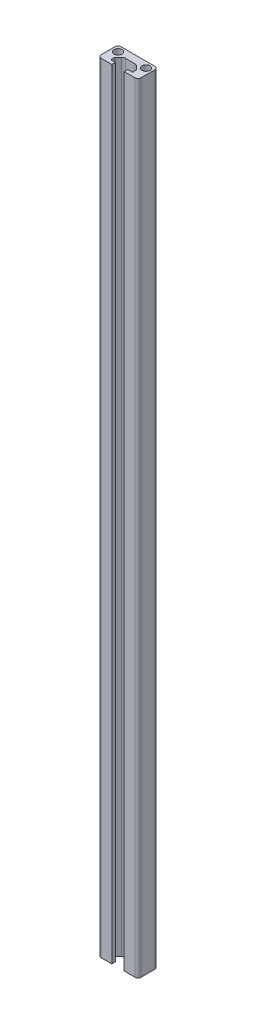
ISO-10303-21;
HEADER;
FILE_DESCRIPTION(('STEP AP214'),'2;1');
FILE_NAME('part.step','',(''),(''),'','','');
FILE_SCHEMA(('AUTOMOTIVE_DESIGN { 1 0 10303 214 1 1 1 1 }'));
ENDSEC;
DATA;
#1=APPLICATION_CONTEXT('core data for automotive mechanical design processes');
#2=APPLICATION_PROTOCOL_DEFINITION('international standard','automotive_design',2000,#1);
#3=PRODUCT_CONTEXT('',#1,'mechanical');
#4=PRODUCT('Part','Part','',(#3));
#5=PRODUCT_RELATED_PRODUCT_CATEGORY('part','',(#4));
#6=PRODUCT_DEFINITION_FORMATION('','',#4);
#7=PRODUCT_DEFINITION_CONTEXT('part definition',#1,'design');
#8=PRODUCT_DEFINITION('design','',#6,#7);
#9=PRODUCT_DEFINITION_SHAPE('','',#8);
#10=(LENGTH_UNIT() NAMED_UNIT(*) SI_UNIT(.MILLI.,.METRE.));
#11=(NAMED_UNIT(*) PLANE_ANGLE_UNIT() SI_UNIT($,.RADIAN.));
#12=(NAMED_UNIT(*) SI_UNIT($,.STERADIAN.) SOLID_ANGLE_UNIT());
#13=UNCERTAINTY_MEASURE_WITH_UNIT(LENGTH_MEASURE(1.E-05),#10,'distance_accuracy_value','');
#14=(GEOMETRIC_REPRESENTATION_CONTEXT(3) GLOBAL_UNCERTAINTY_ASSIGNED_CONTEXT((#13)) GLOBAL_UNIT_ASSIGNED_CONTEXT((#10,
#11,#12)) REPRESENTATION_CONTEXT('',''));
#15=CARTESIAN_POINT('',(0.,0.,0.));
#16=DIRECTION('',(0.,0.,1.));
#17=DIRECTION('',(1.,0.,0.));
#18=AXIS2_PLACEMENT_3D('',#15,#16,#17);
#19=CARTESIAN_POINT('',(-8.5,195.,0.));
#20=DIRECTION('',(0.,0.,-1.));
#21=DIRECTION('',(-1.,0.,0.));
#22=AXIS2_PLACEMENT_3D('',#19,#20,#21);
#23=PLANE('',#22);
#24=DIRECTION('',(1.,0.,0.));
#25=VECTOR('',#24,1.);
#26=CARTESIAN_POINT('',(-8.5,-195.,0.));
#27=LINE('',#26,#25);
#28=CARTESIAN_POINT('',(-8.5,-195.,0.));
#29=VERTEX_POINT('',#28);
#30=CARTESIAN_POINT('',(-3.1,-195.,0.));
#31=VERTEX_POINT('',#30);
#32=EDGE_CURVE('E260',#29,#31,#27,.T.);
#33=ORIENTED_EDGE('',*,*,#32,.T.);
#34=DIRECTION('',(0.,1.,0.));
#35=VECTOR('',#34,1.);
#36=CARTESIAN_POINT('',(-3.1,-195.,0.));
#37=LINE('',#36,#35);
#38=CARTESIAN_POINT('',(-3.1,195.,0.));
#39=VERTEX_POINT('',#38);
#40=EDGE_CURVE('E217',#31,#39,#37,.T.);
#41=ORIENTED_EDGE('',*,*,#40,.T.);
#42=DIRECTION('',(1.,0.,0.));
#43=VECTOR('',#42,1.);
#44=CARTESIAN_POINT('',(-8.5,195.,0.));
#45=LINE('',#44,#43);
#46=CARTESIAN_POINT('',(-8.5,195.,0.));
#47=VERTEX_POINT('',#46);
#48=EDGE_CURVE('E200',#47,#39,#45,.T.);
#49=ORIENTED_EDGE('',*,*,#48,.F.);
#50=DIRECTION('',(0.,-1.,0.));
#51=VECTOR('',#50,1.);
#52=CARTESIAN_POINT('',(-8.5,195.,0.));
#53=LINE('',#52,#51);
#54=EDGE_CURVE('E284',#47,#29,#53,.T.);
#55=ORIENTED_EDGE('',*,*,#54,.T.);
#56=EDGE_LOOP('',(#33,#41,#49,#55));
#57=FACE_BOUND('',#56,.T.);
#58=ADVANCED_FACE('F17',(#57),#23,.F.);
#59=CARTESIAN_POINT('',(-8.5,195.,-8.5));
#60=DIRECTION('',(0.,1.,0.));
#61=DIRECTION('',(0.,0.,1.));
#62=AXIS2_PLACEMENT_3D('',#59,#60,#61);
#63=PLANE('',#62);
#64=DIRECTION('',(1.,0.,0.));
#65=VECTOR('',#64,1.);
#66=CARTESIAN_POINT('',(-5.45,195.,-1.8));
#67=LINE('',#66,#65);
#68=CARTESIAN_POINT('',(-4.95,195.,-1.8));
#69=VERTEX_POINT('',#68);
#70=CARTESIAN_POINT('',(-3.1,195.,-1.8));
#71=VERTEX_POINT('',#70);
#72=EDGE_CURVE('E177',#69,#71,#67,.T.);
#73=ORIENTED_EDGE('',*,*,#72,.F.);
#74=CARTESIAN_POINT('',(-4.95,195.,-2.3));
#75=DIRECTION('',(0.,1.,0.));
#76=DIRECTION('',(0.,0.,1.));
#77=AXIS2_PLACEMENT_3D('',#74,#75,#76);
#78=CIRCLE('',#77,0.5);
#79=CARTESIAN_POINT('',(-5.45,195.,-2.3));
#80=VERTEX_POINT('',#79);
#81=EDGE_CURVE('E25',#69,#80,#78,.F.);
#82=ORIENTED_EDGE('',*,*,#81,.T.);
#83=DIRECTION('',(0.,0.,1.));
#84=VECTOR('',#83,1.);
#85=CARTESIAN_POINT('',(-5.45,195.,-3.9));
#86=LINE('',#85,#84);
#87=CARTESIAN_POINT('',(-5.45,195.,-3.69289321881346));
#88=VERTEX_POINT('',#87);
#89=EDGE_CURVE('E347',#88,#80,#86,.T.);
#90=ORIENTED_EDGE('',*,*,#89,.F.);
#91=CARTESIAN_POINT('',(-4.95,195.,-3.69289321881346));
#92=DIRECTION('',(0.,1.,0.));
#93=DIRECTION('',(0.,0.,1.));
#94=AXIS2_PLACEMENT_3D('',#91,#92,#93);
#95=CIRCLE('',#94,0.5);
#96=CARTESIAN_POINT('',(-5.30355339059327,195.,-4.04644660940673));
#97=VERTEX_POINT('',#96);
#98=EDGE_CURVE('E342',#88,#97,#95,.F.);
#99=ORIENTED_EDGE('',*,*,#98,.T.);
#100=DIRECTION('',(-0.707106781186548,0.,0.707106781186548));
#101=VECTOR('',#100,1.);
#102=CARTESIAN_POINT('',(-5.45,195.,-3.9));
#103=LINE('',#102,#101);
#104=CARTESIAN_POINT('',(-3.83578643762691,195.,-5.5142135623731));
#105=VERTEX_POINT('',#104);
#106=EDGE_CURVE('E352',#105,#97,#103,.T.);
#107=ORIENTED_EDGE('',*,*,#106,.F.);
#108=CARTESIAN_POINT('',(-2.42157287525381,195.,-4.1));
#109=DIRECTION('',(0.,1.,0.));
#110=DIRECTION('',(0.,0.,1.));
#111=AXIS2_PLACEMENT_3D('',#108,#109,#110);
#112=CIRCLE('',#111,2.);
#113=CARTESIAN_POINT('',(-2.42157287525381,195.,-6.1));
#114=VERTEX_POINT('',#113);
#115=EDGE_CURVE('E312',#105,#114,#112,.F.);
#116=ORIENTED_EDGE('',*,*,#115,.T.);
#117=DIRECTION('',(-1.,0.,0.));
#118=VECTOR('',#117,1.);
#119=CARTESIAN_POINT('',(-3.1,195.,-6.1));
#120=LINE('',#119,#118);
#121=CARTESIAN_POINT('',(2.42157287525381,195.,-6.1));
#122=VERTEX_POINT('',#121);
#123=EDGE_CURVE('E204',#122,#114,#120,.T.);
#124=ORIENTED_EDGE('',*,*,#123,.F.);
#125=CARTESIAN_POINT('',(2.42157287525381,195.,-4.1));
#126=DIRECTION('',(0.,1.,0.));
#127=DIRECTION('',(0.,0.,1.));
#128=AXIS2_PLACEMENT_3D('',#125,#126,#127);
#129=CIRCLE('',#128,2.);
#130=CARTESIAN_POINT('',(3.83578643762691,195.,-5.5142135623731));
#131=VERTEX_POINT('',#130);
#132=EDGE_CURVE('E307',#122,#131,#129,.F.);
#133=ORIENTED_EDGE('',*,*,#132,.T.);
#134=DIRECTION('',(-0.707106781186548,0.,-0.707106781186548));
#135=VECTOR('',#134,1.);
#136=CARTESIAN_POINT('',(3.25,195.,-6.1));
#137=LINE('',#136,#135);
#138=CARTESIAN_POINT('',(5.30355339059327,195.,-4.04644660940673));
#139=VERTEX_POINT('',#138);
#140=EDGE_CURVE('E441',#139,#131,#137,.T.);
#141=ORIENTED_EDGE('',*,*,#140,.F.);
#142=CARTESIAN_POINT('',(4.95,195.,-3.69289321881346));
#143=DIRECTION('',(0.,1.,0.));
#144=DIRECTION('',(0.,0.,1.));
#145=AXIS2_PLACEMENT_3D('',#142,#143,#144);
#146=CIRCLE('',#145,0.5);
#147=CARTESIAN_POINT('',(5.45,195.,-3.69289321881346));
#148=VERTEX_POINT('',#147);
#149=EDGE_CURVE('E334',#139,#148,#146,.F.);
#150=ORIENTED_EDGE('',*,*,#149,.T.);
#151=DIRECTION('',(0.,0.,-1.));
#152=VECTOR('',#151,1.);
#153=CARTESIAN_POINT('',(5.45,195.,-3.9));
#154=LINE('',#153,#152);
#155=CARTESIAN_POINT('',(5.45,195.,-2.3));
#156=VERTEX_POINT('',#155);
#157=EDGE_CURVE('E443',#156,#148,#154,.T.);
#158=ORIENTED_EDGE('',*,*,#157,.F.);
#159=CARTESIAN_POINT('',(4.95,195.,-2.3));
#160=DIRECTION('',(0.,1.,0.));
#161=DIRECTION('',(0.,0.,1.));
#162=AXIS2_PLACEMENT_3D('',#159,#160,#161);
#163=CIRCLE('',#162,0.5);
#164=CARTESIAN_POINT('',(4.95,195.,-1.8));
#165=VERTEX_POINT('',#164);
#166=EDGE_CURVE('E338',#156,#165,#163,.F.);
#167=ORIENTED_EDGE('',*,*,#166,.T.);
#168=CARTESIAN_POINT('',(3.1,195.,-1.8));
#169=VERTEX_POINT('',#168);
#170=EDGE_CURVE('E186',#169,#165,#67,.T.);
#171=ORIENTED_EDGE('',*,*,#170,.F.);
#172=DIRECTION('',(0.,0.,-1.));
#173=VECTOR('',#172,1.);
#174=CARTESIAN_POINT('',(3.1,195.,-6.1));
#175=LINE('',#174,#173);
#176=CARTESIAN_POINT('',(3.1,195.,0.));
#177=VERTEX_POINT('',#176);
#178=EDGE_CURVE('E201',#177,#169,#175,.T.);
#179=ORIENTED_EDGE('',*,*,#178,.F.);
#180=CARTESIAN_POINT('',(8.5,195.,0.));
#181=VERTEX_POINT('',#180);
#182=EDGE_CURVE('E242',#177,#181,#45,.T.);
#183=ORIENTED_EDGE('',*,*,#182,.T.);
#184=CARTESIAN_POINT('',(8.5,195.,-1.5));
#185=DIRECTION('',(0.,1.,0.));
#186=DIRECTION('',(0.,0.,1.));
#187=AXIS2_PLACEMENT_3D('',#184,#185,#186);
#188=CIRCLE('',#187,1.5);
#189=CARTESIAN_POINT('',(10.,195.,-1.5));
#190=VERTEX_POINT('',#189);
#191=EDGE_CURVE('E244',#181,#190,#188,.T.);
#192=ORIENTED_EDGE('',*,*,#191,.T.);
#193=DIRECTION('',(0.,0.,-1.));
#194=VECTOR('',#193,1.);
#195=CARTESIAN_POINT('',(10.,195.,-8.5));
#196=LINE('',#195,#194);
#197=CARTESIAN_POINT('',(10.,195.,-8.5));
#198=VERTEX_POINT('',#197);
#199=EDGE_CURVE('E246',#190,#198,#196,.T.);
#200=ORIENTED_EDGE('',*,*,#199,.T.);
#201=CARTESIAN_POINT('',(8.5,195.,-8.5));
#202=DIRECTION('',(0.,1.,0.));
#203=DIRECTION('',(0.,0.,-1.));
#204=AXIS2_PLACEMENT_3D('',#201,#202,#203);
#205=CIRCLE('',#204,1.5);
#206=CARTESIAN_POINT('',(8.5,195.,-10.));
#207=VERTEX_POINT('',#206);
#208=EDGE_CURVE('E248',#198,#207,#205,.T.);
#209=ORIENTED_EDGE('',*,*,#208,.T.);
#210=DIRECTION('',(-1.,0.,0.));
#211=VECTOR('',#210,1.);
#212=CARTESIAN_POINT('',(-8.5,195.,-10.));
#213=LINE('',#212,#211);
#214=CARTESIAN_POINT('',(-8.5,195.,-10.));
#215=VERTEX_POINT('',#214);
#216=EDGE_CURVE('E250',#207,#215,#213,.T.);
#217=ORIENTED_EDGE('',*,*,#216,.T.);
#218=CARTESIAN_POINT('',(-8.5,195.,-8.5));
#219=DIRECTION('',(0.,1.,0.));
#220=DIRECTION('',(0.,0.,1.));
#221=AXIS2_PLACEMENT_3D('',#218,#219,#220);
#222=CIRCLE('',#221,1.5);
#223=CARTESIAN_POINT('',(-10.,195.,-8.5));
#224=VERTEX_POINT('',#223);
#225=EDGE_CURVE('E234',#215,#224,#222,.T.);
#226=ORIENTED_EDGE('',*,*,#225,.T.);
#227=DIRECTION('',(0.,0.,1.));
#228=VECTOR('',#227,1.);
#229=CARTESIAN_POINT('',(-10.,195.,-8.5));
#230=LINE('',#229,#228);
#231=CARTESIAN_POINT('',(-10.,195.,-1.5));
#232=VERTEX_POINT('',#231);
#233=EDGE_CURVE('E237',#224,#232,#230,.T.);
#234=ORIENTED_EDGE('',*,*,#233,.T.);
#235=CARTESIAN_POINT('',(-8.5,195.,-1.5));
#236=DIRECTION('',(0.,1.,0.));
#237=DIRECTION('',(0.,0.,1.));
#238=AXIS2_PLACEMENT_3D('',#235,#236,#237);
#239=CIRCLE('',#238,1.5);
#240=EDGE_CURVE('E240',#232,#47,#239,.T.);
#241=ORIENTED_EDGE('',*,*,#240,.T.);
#242=ORIENTED_EDGE('',*,*,#48,.T.);
#243=DIRECTION('',(0.,0.,1.));
#244=VECTOR('',#243,1.);
#245=CARTESIAN_POINT('',(-3.1,195.,-6.1));
#246=LINE('',#245,#244);
#247=EDGE_CURVE('E191',#71,#39,#246,.T.);
#248=ORIENTED_EDGE('',*,*,#247,.F.);
#249=EDGE_LOOP('',(#73,#82,#90,#99,#107,#116,#124,#133,#141,#150,#158,#167,#171,#179,#183,#192,
#200,#209,#217,#226,#234,#241,#242,#248));
#250=FACE_BOUND('',#249,.T.);
#251=CARTESIAN_POINT('',(-7.,195.,-7.));
#252=DIRECTION('',(0.,1.,0.));
#253=DIRECTION('',(0.,0.,1.));
#254=AXIS2_PLACEMENT_3D('',#251,#252,#253);
#255=CIRCLE('',#254,2.);
#256=CARTESIAN_POINT('',(-7.,195.,-5.));
#257=VERTEX_POINT('',#256);
#258=EDGE_CURVE('E228',#257,#257,#255,.T.);
#259=ORIENTED_EDGE('',*,*,#258,.F.);
#260=EDGE_LOOP('',(#259));
#261=FACE_BOUND('',#260,.T.);
#262=CARTESIAN_POINT('',(7.,195.,-7.));
#263=DIRECTION('',(0.,1.,0.));
#264=DIRECTION('',(0.,0.,1.));
#265=AXIS2_PLACEMENT_3D('',#262,#263,#264);
#266=CIRCLE('',#265,2.);
#267=CARTESIAN_POINT('',(7.,195.,-5.));
#268=VERTEX_POINT('',#267);
#269=EDGE_CURVE('E222',#268,#268,#266,.T.);
#270=ORIENTED_EDGE('',*,*,#269,.F.);
#271=EDGE_LOOP('',(#270));
#272=FACE_BOUND('',#271,.T.);
#273=ADVANCED_FACE('F197',(#250,#261,#272),#63,.T.);
#274=CARTESIAN_POINT('',(-8.5,-195.,-8.5));
#275=DIRECTION('',(0.,1.,0.));
#276=DIRECTION('',(0.,0.,1.));
#277=AXIS2_PLACEMENT_3D('',#274,#275,#276);
#278=PLANE('',#277);
#279=DIRECTION('',(-0.707106781186548,0.,0.707106781186548));
#280=VECTOR('',#279,1.);
#281=CARTESIAN_POINT('',(-5.45,-195.,-3.9));
#282=LINE('',#281,#280);
#283=CARTESIAN_POINT('',(-3.83578643762691,-195.,-5.5142135623731));
#284=VERTEX_POINT('',#283);
#285=CARTESIAN_POINT('',(-5.30355339059327,-195.,-4.04644660940673));
#286=VERTEX_POINT('',#285);
#287=EDGE_CURVE('E433',#284,#286,#282,.T.);
#288=ORIENTED_EDGE('',*,*,#287,.T.);
#289=CARTESIAN_POINT('',(-4.95,-195.,-3.69289321881346));
#290=DIRECTION('',(0.,1.,0.));
#291=DIRECTION('',(0.,0.,1.));
#292=AXIS2_PLACEMENT_3D('',#289,#290,#291);
#293=CIRCLE('',#292,0.5);
#294=CARTESIAN_POINT('',(-5.45,-195.,-3.69289321881346));
#295=VERTEX_POINT('',#294);
#296=EDGE_CURVE('E344',#286,#295,#293,.T.);
#297=ORIENTED_EDGE('',*,*,#296,.T.);
#298=DIRECTION('',(0.,0.,1.));
#299=VECTOR('',#298,1.);
#300=CARTESIAN_POINT('',(-5.45,-195.,-3.9));
#301=LINE('',#300,#299);
#302=CARTESIAN_POINT('',(-5.45,-195.,-2.3));
#303=VERTEX_POINT('',#302);
#304=EDGE_CURVE('E430',#295,#303,#301,.T.);
#305=ORIENTED_EDGE('',*,*,#304,.T.);
#306=CARTESIAN_POINT('',(-4.95,-195.,-2.3));
#307=DIRECTION('',(0.,1.,0.));
#308=DIRECTION('',(0.,0.,1.));
#309=AXIS2_PLACEMENT_3D('',#306,#307,#308);
#310=CIRCLE('',#309,0.5);
#311=CARTESIAN_POINT('',(-4.95,-195.,-1.8));
#312=VERTEX_POINT('',#311);
#313=EDGE_CURVE('E11',#303,#312,#310,.T.);
#314=ORIENTED_EDGE('',*,*,#313,.T.);
#315=DIRECTION('',(1.,0.,0.));
#316=VECTOR('',#315,1.);
#317=CARTESIAN_POINT('',(-5.45,-195.,-1.8));
#318=LINE('',#317,#316);
#319=CARTESIAN_POINT('',(-3.1,-195.,-1.8));
#320=VERTEX_POINT('',#319);
#321=EDGE_CURVE('E194',#312,#320,#318,.T.);
#322=ORIENTED_EDGE('',*,*,#321,.T.);
#323=DIRECTION('',(0.,0.,1.));
#324=VECTOR('',#323,1.);
#325=CARTESIAN_POINT('',(-3.1,-195.,-6.1));
#326=LINE('',#325,#324);
#327=EDGE_CURVE('E193',#320,#31,#326,.T.);
#328=ORIENTED_EDGE('',*,*,#327,.T.);
#329=ORIENTED_EDGE('',*,*,#32,.F.);
#330=CARTESIAN_POINT('',(-8.5,-195.,-1.5));
#331=DIRECTION('',(0.,1.,0.));
#332=DIRECTION('',(0.,0.,1.));
#333=AXIS2_PLACEMENT_3D('',#330,#331,#332);
#334=CIRCLE('',#333,1.5);
#335=CARTESIAN_POINT('',(-10.,-195.,-1.5));
#336=VERTEX_POINT('',#335);
#337=EDGE_CURVE('E257',#336,#29,#334,.T.);
#338=ORIENTED_EDGE('',*,*,#337,.F.);
#339=DIRECTION('',(0.,0.,1.));
#340=VECTOR('',#339,1.);
#341=CARTESIAN_POINT('',(-10.,-195.,-8.5));
#342=LINE('',#341,#340);
#343=CARTESIAN_POINT('',(-10.,-195.,-8.5));
#344=VERTEX_POINT('',#343);
#345=EDGE_CURVE('E255',#344,#336,#342,.T.);
#346=ORIENTED_EDGE('',*,*,#345,.F.);
#347=CARTESIAN_POINT('',(-8.5,-195.,-8.5));
#348=DIRECTION('',(0.,1.,0.));
#349=DIRECTION('',(0.,0.,1.));
#350=AXIS2_PLACEMENT_3D('',#347,#348,#349);
#351=CIRCLE('',#350,1.5);
#352=CARTESIAN_POINT('',(-8.5,-195.,-10.));
#353=VERTEX_POINT('',#352);
#354=EDGE_CURVE('E231',#353,#344,#351,.T.);
#355=ORIENTED_EDGE('',*,*,#354,.F.);
#356=DIRECTION('',(-1.,0.,0.));
#357=VECTOR('',#356,1.);
#358=CARTESIAN_POINT('',(-8.5,-195.,-10.));
#359=LINE('',#358,#357);
#360=CARTESIAN_POINT('',(8.5,-195.,-10.));
#361=VERTEX_POINT('',#360);
#362=EDGE_CURVE('E238',#361,#353,#359,.T.);
#363=ORIENTED_EDGE('',*,*,#362,.F.);
#364=CARTESIAN_POINT('',(8.5,-195.,-8.5));
#365=DIRECTION('',(0.,1.,0.));
#366=DIRECTION('',(0.,0.,-1.));
#367=AXIS2_PLACEMENT_3D('',#364,#365,#366);
#368=CIRCLE('',#367,1.5);
#369=CARTESIAN_POINT('',(10.,-195.,-8.5));
#370=VERTEX_POINT('',#369);
#371=EDGE_CURVE('E267',#370,#361,#368,.T.);
#372=ORIENTED_EDGE('',*,*,#371,.F.);
#373=DIRECTION('',(0.,0.,-1.));
#374=VECTOR('',#373,1.);
#375=CARTESIAN_POINT('',(10.,-195.,-8.5));
#376=LINE('',#375,#374);
#377=CARTESIAN_POINT('',(10.,-195.,-1.5));
#378=VERTEX_POINT('',#377);
#379=EDGE_CURVE('E265',#378,#370,#376,.T.);
#380=ORIENTED_EDGE('',*,*,#379,.F.);
#381=CARTESIAN_POINT('',(8.5,-195.,-1.5));
#382=DIRECTION('',(0.,1.,0.));
#383=DIRECTION('',(0.,0.,1.));
#384=AXIS2_PLACEMENT_3D('',#381,#382,#383);
#385=CIRCLE('',#384,1.5);
#386=CARTESIAN_POINT('',(8.5,-195.,0.));
#387=VERTEX_POINT('',#386);
#388=EDGE_CURVE('E263',#387,#378,#385,.T.);
#389=ORIENTED_EDGE('',*,*,#388,.F.);
#390=CARTESIAN_POINT('',(3.1,-195.,0.));
#391=VERTEX_POINT('',#390);
#392=EDGE_CURVE('E259',#391,#387,#27,.T.);
#393=ORIENTED_EDGE('',*,*,#392,.F.);
#394=DIRECTION('',(0.,0.,-1.));
#395=VECTOR('',#394,1.);
#396=CARTESIAN_POINT('',(3.1,-195.,-6.1));
#397=LINE('',#396,#395);
#398=CARTESIAN_POINT('',(3.1,-195.,-1.8));
#399=VERTEX_POINT('',#398);
#400=EDGE_CURVE('E211',#391,#399,#397,.T.);
#401=ORIENTED_EDGE('',*,*,#400,.T.);
#402=CARTESIAN_POINT('',(4.95,-195.,-1.8));
#403=VERTEX_POINT('',#402);
#404=EDGE_CURVE('E402',#399,#403,#318,.T.);
#405=ORIENTED_EDGE('',*,*,#404,.T.);
#406=CARTESIAN_POINT('',(4.95,-195.,-2.3));
#407=DIRECTION('',(0.,1.,0.));
#408=DIRECTION('',(0.,0.,1.));
#409=AXIS2_PLACEMENT_3D('',#406,#407,#408);
#410=CIRCLE('',#409,0.5);
#411=CARTESIAN_POINT('',(5.45,-195.,-2.3));
#412=VERTEX_POINT('',#411);
#413=EDGE_CURVE('E340',#403,#412,#410,.T.);
#414=ORIENTED_EDGE('',*,*,#413,.T.);
#415=DIRECTION('',(0.,0.,-1.));
#416=VECTOR('',#415,1.);
#417=CARTESIAN_POINT('',(5.45,-195.,-3.9));
#418=LINE('',#417,#416);
#419=CARTESIAN_POINT('',(5.45,-195.,-3.69289321881346));
#420=VERTEX_POINT('',#419);
#421=EDGE_CURVE('E185',#412,#420,#418,.T.);
#422=ORIENTED_EDGE('',*,*,#421,.T.);
#423=CARTESIAN_POINT('',(4.95,-195.,-3.69289321881346));
#424=DIRECTION('',(0.,1.,0.));
#425=DIRECTION('',(0.,0.,1.));
#426=AXIS2_PLACEMENT_3D('',#423,#424,#425);
#427=CIRCLE('',#426,0.5);
#428=CARTESIAN_POINT('',(5.30355339059327,-195.,-4.04644660940673));
#429=VERTEX_POINT('',#428);
#430=EDGE_CURVE('E336',#420,#429,#427,.T.);
#431=ORIENTED_EDGE('',*,*,#430,.T.);
#432=DIRECTION('',(-0.707106781186548,0.,-0.707106781186548));
#433=VECTOR('',#432,1.);
#434=CARTESIAN_POINT('',(3.25,-195.,-6.1));
#435=LINE('',#434,#433);
#436=CARTESIAN_POINT('',(3.83578643762691,-195.,-5.5142135623731));
#437=VERTEX_POINT('',#436);
#438=EDGE_CURVE('E435',#429,#437,#435,.T.);
#439=ORIENTED_EDGE('',*,*,#438,.T.);
#440=CARTESIAN_POINT('',(2.42157287525381,-195.,-4.1));
#441=DIRECTION('',(0.,1.,0.));
#442=DIRECTION('',(0.,0.,1.));
#443=AXIS2_PLACEMENT_3D('',#440,#441,#442);
#444=CIRCLE('',#443,2.);
#445=CARTESIAN_POINT('',(2.42157287525381,-195.,-6.1));
#446=VERTEX_POINT('',#445);
#447=EDGE_CURVE('E310',#437,#446,#444,.T.);
#448=ORIENTED_EDGE('',*,*,#447,.T.);
#449=DIRECTION('',(-1.,0.,0.));
#450=VECTOR('',#449,1.);
#451=CARTESIAN_POINT('',(-3.1,-195.,-6.1));
#452=LINE('',#451,#450);
#453=CARTESIAN_POINT('',(-2.42157287525381,-195.,-6.1));
#454=VERTEX_POINT('',#453);
#455=EDGE_CURVE('E214',#446,#454,#452,.T.);
#456=ORIENTED_EDGE('',*,*,#455,.T.);
#457=CARTESIAN_POINT('',(-2.42157287525381,-195.,-4.1));
#458=DIRECTION('',(0.,1.,0.));
#459=DIRECTION('',(0.,0.,1.));
#460=AXIS2_PLACEMENT_3D('',#457,#458,#459);
#461=CIRCLE('',#460,2.);
#462=EDGE_CURVE('E314',#454,#284,#461,.T.);
#463=ORIENTED_EDGE('',*,*,#462,.T.);
#464=EDGE_LOOP('',(#288,#297,#305,#314,#322,#328,#329,#338,#346,#355,#363,#372,#380,#389,#393,
#401,#405,#414,#422,#431,#439,#448,#456,#463));
#465=FACE_BOUND('',#464,.T.);
#466=CARTESIAN_POINT('',(-7.,-195.,-7.));
#467=DIRECTION('',(0.,1.,0.));
#468=DIRECTION('',(0.,0.,1.));
#469=AXIS2_PLACEMENT_3D('',#466,#467,#468);
#470=CIRCLE('',#469,2.);
#471=CARTESIAN_POINT('',(-7.,-195.,-5.));
#472=VERTEX_POINT('',#471);
#473=EDGE_CURVE('E225',#472,#472,#470,.T.);
#474=ORIENTED_EDGE('',*,*,#473,.T.);
#475=EDGE_LOOP('',(#474));
#476=FACE_BOUND('',#475,.T.);
#477=CARTESIAN_POINT('',(7.,-195.,-7.));
#478=DIRECTION('',(0.,1.,0.));
#479=DIRECTION('',(0.,0.,1.));
#480=AXIS2_PLACEMENT_3D('',#477,#478,#479);
#481=CIRCLE('',#480,2.);
#482=CARTESIAN_POINT('',(7.,-195.,-5.));
#483=VERTEX_POINT('',#482);
#484=EDGE_CURVE('E220',#483,#483,#481,.T.);
#485=ORIENTED_EDGE('',*,*,#484,.T.);
#486=EDGE_LOOP('',(#485));
#487=FACE_BOUND('',#486,.T.);
#488=ADVANCED_FACE('F371',(#465,#476,#487),#278,.F.);
#489=CARTESIAN_POINT('',(-8.5,195.,-8.5));
#490=DIRECTION('',(0.,-1.,0.));
#491=DIRECTION('',(0.,0.,-1.));
#492=AXIS2_PLACEMENT_3D('',#489,#490,#491);
#493=CYLINDRICAL_SURFACE('',#492,1.5);
#494=ORIENTED_EDGE('',*,*,#354,.T.);
#495=DIRECTION('',(0.,-1.,0.));
#496=VECTOR('',#495,1.);
#497=CARTESIAN_POINT('',(-10.,195.,-8.5));
#498=LINE('',#497,#496);
#499=EDGE_CURVE('E290',#224,#344,#498,.T.);
#500=ORIENTED_EDGE('',*,*,#499,.F.);
#501=ORIENTED_EDGE('',*,*,#225,.F.);
#502=DIRECTION('',(0.,-1.,0.));
#503=VECTOR('',#502,1.);
#504=CARTESIAN_POINT('',(-8.5,195.,-10.));
#505=LINE('',#504,#503);
#506=EDGE_CURVE('E252',#215,#353,#505,.T.);
#507=ORIENTED_EDGE('',*,*,#506,.T.);
#508=EDGE_LOOP('',(#494,#500,#501,#507));
#509=FACE_BOUND('',#508,.T.);
#510=ADVANCED_FACE('F423',(#509),#493,.T.);
#511=CARTESIAN_POINT('',(-10.,195.,-8.5));
#512=DIRECTION('',(1.,0.,0.));
#513=DIRECTION('',(0.,0.,-1.));
#514=AXIS2_PLACEMENT_3D('',#511,#512,#513);
#515=PLANE('',#514);
#516=ORIENTED_EDGE('',*,*,#345,.T.);
#517=DIRECTION('',(0.,-1.,0.));
#518=VECTOR('',#517,1.);
#519=CARTESIAN_POINT('',(-10.,195.,-1.5));
#520=LINE('',#519,#518);
#521=EDGE_CURVE('E287',#232,#336,#520,.T.);
#522=ORIENTED_EDGE('',*,*,#521,.F.);
#523=ORIENTED_EDGE('',*,*,#233,.F.);
#524=ORIENTED_EDGE('',*,*,#499,.T.);
#525=EDGE_LOOP('',(#516,#522,#523,#524));
#526=FACE_BOUND('',#525,.T.);
#527=ADVANCED_FACE('F386',(#526),#515,.F.);
#528=CARTESIAN_POINT('',(-8.5,195.,-1.5));
#529=DIRECTION('',(0.,-1.,0.));
#530=DIRECTION('',(0.,0.,-1.));
#531=AXIS2_PLACEMENT_3D('',#528,#529,#530);
#532=CYLINDRICAL_SURFACE('',#531,1.5);
#533=ORIENTED_EDGE('',*,*,#337,.T.);
#534=ORIENTED_EDGE('',*,*,#54,.F.);
#535=ORIENTED_EDGE('',*,*,#240,.F.);
#536=ORIENTED_EDGE('',*,*,#521,.T.);
#537=EDGE_LOOP('',(#533,#534,#535,#536));
#538=FACE_BOUND('',#537,.T.);
#539=ADVANCED_FACE('F377',(#538),#532,.T.);
#540=ORIENTED_EDGE('',*,*,#182,.F.);
#541=DIRECTION('',(0.,1.,0.));
#542=VECTOR('',#541,1.);
#543=CARTESIAN_POINT('',(3.1,-195.,0.));
#544=LINE('',#543,#542);
#545=EDGE_CURVE('E218',#391,#177,#544,.T.);
#546=ORIENTED_EDGE('',*,*,#545,.F.);
#547=ORIENTED_EDGE('',*,*,#392,.T.);
#548=DIRECTION('',(0.,-1.,0.));
#549=VECTOR('',#548,1.);
#550=CARTESIAN_POINT('',(8.5,195.,0.));
#551=LINE('',#550,#549);
#552=EDGE_CURVE('E281',#181,#387,#551,.T.);
#553=ORIENTED_EDGE('',*,*,#552,.F.);
#554=EDGE_LOOP('',(#540,#546,#547,#553));
#555=FACE_BOUND('',#554,.T.);
#556=ADVANCED_FACE('F366',(#555),#23,.F.);
#557=CARTESIAN_POINT('',(8.5,195.,-1.5));
#558=DIRECTION('',(0.,-1.,0.));
#559=DIRECTION('',(0.,0.,-1.));
#560=AXIS2_PLACEMENT_3D('',#557,#558,#559);
#561=CYLINDRICAL_SURFACE('',#560,1.5);
#562=ORIENTED_EDGE('',*,*,#388,.T.);
#563=DIRECTION('',(0.,-1.,0.));
#564=VECTOR('',#563,1.);
#565=CARTESIAN_POINT('',(10.,195.,-1.5));
#566=LINE('',#565,#564);
#567=EDGE_CURVE('E278',#190,#378,#566,.T.);
#568=ORIENTED_EDGE('',*,*,#567,.F.);
#569=ORIENTED_EDGE('',*,*,#191,.F.);
#570=ORIENTED_EDGE('',*,*,#552,.T.);
#571=EDGE_LOOP('',(#562,#568,#569,#570));
#572=FACE_BOUND('',#571,.T.);
#573=ADVANCED_FACE('F376',(#572),#561,.T.);
#574=CARTESIAN_POINT('',(10.,195.,-8.5));
#575=DIRECTION('',(-1.,0.,0.));
#576=DIRECTION('',(0.,0.,1.));
#577=AXIS2_PLACEMENT_3D('',#574,#575,#576);
#578=PLANE('',#577);
#579=ORIENTED_EDGE('',*,*,#379,.T.);
#580=DIRECTION('',(0.,-1.,0.));
#581=VECTOR('',#580,1.);
#582=CARTESIAN_POINT('',(10.,195.,-8.5));
#583=LINE('',#582,#581);
#584=EDGE_CURVE('E275',#198,#370,#583,.T.);
#585=ORIENTED_EDGE('',*,*,#584,.F.);
#586=ORIENTED_EDGE('',*,*,#199,.F.);
#587=ORIENTED_EDGE('',*,*,#567,.T.);
#588=EDGE_LOOP('',(#579,#585,#586,#587));
#589=FACE_BOUND('',#588,.T.);
#590=ADVANCED_FACE('F384',(#589),#578,.F.);
#591=CARTESIAN_POINT('',(8.5,195.,-8.5));
#592=DIRECTION('',(0.,-1.,0.));
#593=DIRECTION('',(0.,0.,-1.));
#594=AXIS2_PLACEMENT_3D('',#591,#592,#593);
#595=CYLINDRICAL_SURFACE('',#594,1.5);
#596=ORIENTED_EDGE('',*,*,#371,.T.);
#597=DIRECTION('',(0.,-1.,0.));
#598=VECTOR('',#597,1.);
#599=CARTESIAN_POINT('',(8.5,195.,-10.));
#600=LINE('',#599,#598);
#601=EDGE_CURVE('E272',#207,#361,#600,.T.);
#602=ORIENTED_EDGE('',*,*,#601,.F.);
#603=ORIENTED_EDGE('',*,*,#208,.F.);
#604=ORIENTED_EDGE('',*,*,#584,.T.);
#605=EDGE_LOOP('',(#596,#602,#603,#604));
#606=FACE_BOUND('',#605,.T.);
#607=ADVANCED_FACE('F414',(#606),#595,.T.);
#608=CARTESIAN_POINT('',(-8.5,195.,-10.));
#609=DIRECTION('',(0.,0.,1.));
#610=DIRECTION('',(1.,0.,0.));
#611=AXIS2_PLACEMENT_3D('',#608,#609,#610);
#612=PLANE('',#611);
#613=ORIENTED_EDGE('',*,*,#362,.T.);
#614=ORIENTED_EDGE('',*,*,#506,.F.);
#615=ORIENTED_EDGE('',*,*,#216,.F.);
#616=ORIENTED_EDGE('',*,*,#601,.T.);
#617=EDGE_LOOP('',(#613,#614,#615,#616));
#618=FACE_BOUND('',#617,.T.);
#619=ADVANCED_FACE('F418',(#618),#612,.F.);
#620=CARTESIAN_POINT('',(-7.,195.,-7.));
#621=DIRECTION('',(0.,-1.,0.));
#622=DIRECTION('',(0.,0.,-1.));
#623=AXIS2_PLACEMENT_3D('',#620,#621,#622);
#624=CYLINDRICAL_SURFACE('',#623,2.);
#625=ORIENTED_EDGE('',*,*,#258,.T.);
#626=EDGE_LOOP('',(#625));
#627=FACE_BOUND('',#626,.T.);
#628=ORIENTED_EDGE('',*,*,#473,.F.);
#629=EDGE_LOOP('',(#628));
#630=FACE_BOUND('',#629,.T.);
#631=ADVANCED_FACE('F504',(#627,#630),#624,.F.);
#632=CARTESIAN_POINT('',(7.,195.,-7.));
#633=DIRECTION('',(0.,-1.,0.));
#634=DIRECTION('',(0.,0.,-1.));
#635=AXIS2_PLACEMENT_3D('',#632,#633,#634);
#636=CYLINDRICAL_SURFACE('',#635,2.);
#637=ORIENTED_EDGE('',*,*,#269,.T.);
#638=EDGE_LOOP('',(#637));
#639=FACE_BOUND('',#638,.T.);
#640=ORIENTED_EDGE('',*,*,#484,.F.);
#641=EDGE_LOOP('',(#640));
#642=FACE_BOUND('',#641,.T.);
#643=ADVANCED_FACE('F501',(#639,#642),#636,.F.);
#644=CARTESIAN_POINT('',(-3.1,-195.,-6.1));
#645=DIRECTION('',(-1.,0.,0.));
#646=DIRECTION('',(0.,0.,1.));
#647=AXIS2_PLACEMENT_3D('',#644,#645,#646);
#648=PLANE('',#647);
#649=ORIENTED_EDGE('',*,*,#327,.F.);
#650=DIRECTION('',(0.,1.,0.));
#651=VECTOR('',#650,1.);
#652=CARTESIAN_POINT('',(-3.1,-195.,-1.8));
#653=LINE('',#652,#651);
#654=EDGE_CURVE('E180',#320,#71,#653,.T.);
#655=ORIENTED_EDGE('',*,*,#654,.T.);
#656=ORIENTED_EDGE('',*,*,#247,.T.);
#657=ORIENTED_EDGE('',*,*,#40,.F.);
#658=EDGE_LOOP('',(#649,#655,#656,#657));
#659=FACE_BOUND('',#658,.T.);
#660=ADVANCED_FACE('F189',(#659),#648,.F.);
#661=CARTESIAN_POINT('',(-3.1,-195.,-6.1));
#662=DIRECTION('',(0.,0.,-1.));
#663=DIRECTION('',(-1.,0.,0.));
#664=AXIS2_PLACEMENT_3D('',#661,#662,#663);
#665=PLANE('',#664);
#666=ORIENTED_EDGE('',*,*,#455,.F.);
#667=DIRECTION('',(0.,1.,0.));
#668=VECTOR('',#667,1.);
#669=CARTESIAN_POINT('',(2.42157287525381,195.,-6.1));
#670=LINE('',#669,#668);
#671=EDGE_CURVE('E298',#446,#122,#670,.T.);
#672=ORIENTED_EDGE('',*,*,#671,.T.);
#673=ORIENTED_EDGE('',*,*,#123,.T.);
#674=DIRECTION('',(0.,1.,0.));
#675=VECTOR('',#674,1.);
#676=CARTESIAN_POINT('',(-2.42157287525381,-195.,-6.1));
#677=LINE('',#676,#675);
#678=EDGE_CURVE('E296',#114,#454,#677,.F.);
#679=ORIENTED_EDGE('',*,*,#678,.T.);
#680=EDGE_LOOP('',(#666,#672,#673,#679));
#681=FACE_BOUND('',#680,.T.);
#682=ADVANCED_FACE('F467',(#681),#665,.F.);
#683=CARTESIAN_POINT('',(3.1,-195.,-6.1));
#684=DIRECTION('',(1.,0.,0.));
#685=DIRECTION('',(0.,0.,-1.));
#686=AXIS2_PLACEMENT_3D('',#683,#684,#685);
#687=PLANE('',#686);
#688=ORIENTED_EDGE('',*,*,#178,.T.);
#689=DIRECTION('',(0.,-1.,0.));
#690=VECTOR('',#689,1.);
#691=CARTESIAN_POINT('',(3.1,-195.,-1.8));
#692=LINE('',#691,#690);
#693=EDGE_CURVE('E293',#169,#399,#692,.T.);
#694=ORIENTED_EDGE('',*,*,#693,.T.);
#695=ORIENTED_EDGE('',*,*,#400,.F.);
#696=ORIENTED_EDGE('',*,*,#545,.T.);
#697=EDGE_LOOP('',(#688,#694,#695,#696));
#698=FACE_BOUND('',#697,.T.);
#699=ADVANCED_FACE('F398',(#698),#687,.F.);
#700=CARTESIAN_POINT('',(-5.45,-195.,-1.8));
#701=DIRECTION('',(0.,0.,1.));
#702=DIRECTION('',(1.,0.,0.));
#703=AXIS2_PLACEMENT_3D('',#700,#701,#702);
#704=PLANE('',#703);
#705=ORIENTED_EDGE('',*,*,#170,.T.);
#706=DIRECTION('',(0.,1.,0.));
#707=VECTOR('',#706,1.);
#708=CARTESIAN_POINT('',(4.95,-195.,-1.8));
#709=LINE('',#708,#707);
#710=EDGE_CURVE('E324',#165,#403,#709,.F.);
#711=ORIENTED_EDGE('',*,*,#710,.T.);
#712=ORIENTED_EDGE('',*,*,#404,.F.);
#713=ORIENTED_EDGE('',*,*,#693,.F.);
#714=EDGE_LOOP('',(#705,#711,#712,#713));
#715=FACE_BOUND('',#714,.T.);
#716=ADVANCED_FACE('F492',(#715),#704,.F.);
#717=CARTESIAN_POINT('',(3.25,-195.,-6.1));
#718=DIRECTION('',(0.707106781186548,0.,-0.707106781186548));
#719=DIRECTION('',(-0.707106781186548,0.,-0.707106781186548));
#720=AXIS2_PLACEMENT_3D('',#717,#718,#719);
#721=PLANE('',#720);
#722=ORIENTED_EDGE('',*,*,#438,.F.);
#723=DIRECTION('',(0.,1.,0.));
#724=VECTOR('',#723,1.);
#725=CARTESIAN_POINT('',(5.30355339059327,195.,-4.04644660940673));
#726=LINE('',#725,#724);
#727=EDGE_CURVE('E316',#429,#139,#726,.T.);
#728=ORIENTED_EDGE('',*,*,#727,.T.);
#729=ORIENTED_EDGE('',*,*,#140,.T.);
#730=DIRECTION('',(0.,1.,0.));
#731=VECTOR('',#730,1.);
#732=CARTESIAN_POINT('',(3.83578643762691,-195.,-5.5142135623731));
#733=LINE('',#732,#731);
#734=EDGE_CURVE('E301',#131,#437,#733,.F.);
#735=ORIENTED_EDGE('',*,*,#734,.T.);
#736=EDGE_LOOP('',(#722,#728,#729,#735));
#737=FACE_BOUND('',#736,.T.);
#738=ADVANCED_FACE('F457',(#737),#721,.F.);
#739=CARTESIAN_POINT('',(5.45,-195.,-3.9));
#740=DIRECTION('',(1.,0.,0.));
#741=DIRECTION('',(0.,0.,-1.));
#742=AXIS2_PLACEMENT_3D('',#739,#740,#741);
#743=PLANE('',#742);
#744=ORIENTED_EDGE('',*,*,#157,.T.);
#745=DIRECTION('',(0.,1.,0.));
#746=VECTOR('',#745,1.);
#747=CARTESIAN_POINT('',(5.45,-195.,-3.69289321881346));
#748=LINE('',#747,#746);
#749=EDGE_CURVE('E322',#148,#420,#748,.F.);
#750=ORIENTED_EDGE('',*,*,#749,.T.);
#751=ORIENTED_EDGE('',*,*,#421,.F.);
#752=DIRECTION('',(0.,1.,0.));
#753=VECTOR('',#752,1.);
#754=CARTESIAN_POINT('',(5.45,195.,-2.3));
#755=LINE('',#754,#753);
#756=EDGE_CURVE('E319',#412,#156,#755,.T.);
#757=ORIENTED_EDGE('',*,*,#756,.T.);
#758=EDGE_LOOP('',(#744,#750,#751,#757));
#759=FACE_BOUND('',#758,.T.);
#760=ADVANCED_FACE('F448',(#759),#743,.F.);
#761=ORIENTED_EDGE('',*,*,#321,.F.);
#762=DIRECTION('',(0.,1.,0.));
#763=VECTOR('',#762,1.);
#764=CARTESIAN_POINT('',(-4.95,195.,-1.8));
#765=LINE('',#764,#763);
#766=EDGE_CURVE('E182',#312,#69,#765,.T.);
#767=ORIENTED_EDGE('',*,*,#766,.T.);
#768=ORIENTED_EDGE('',*,*,#72,.T.);
#769=ORIENTED_EDGE('',*,*,#654,.F.);
#770=EDGE_LOOP('',(#761,#767,#768,#769));
#771=FACE_BOUND('',#770,.T.);
#772=ADVANCED_FACE('F179',(#771),#704,.F.);
#773=CARTESIAN_POINT('',(-5.45,-195.,-3.9));
#774=DIRECTION('',(-1.,0.,0.));
#775=DIRECTION('',(0.,0.,1.));
#776=AXIS2_PLACEMENT_3D('',#773,#774,#775);
#777=PLANE('',#776);
#778=ORIENTED_EDGE('',*,*,#304,.F.);
#779=DIRECTION('',(0.,1.,0.));
#780=VECTOR('',#779,1.);
#781=CARTESIAN_POINT('',(-5.45,195.,-3.69289321881346));
#782=LINE('',#781,#780);
#783=EDGE_CURVE('E328',#295,#88,#782,.T.);
#784=ORIENTED_EDGE('',*,*,#783,.T.);
#785=ORIENTED_EDGE('',*,*,#89,.T.);
#786=DIRECTION('',(0.,1.,0.));
#787=VECTOR('',#786,1.);
#788=CARTESIAN_POINT('',(-5.45,-195.,-2.3));
#789=LINE('',#788,#787);
#790=EDGE_CURVE('E326',#80,#303,#789,.F.);
#791=ORIENTED_EDGE('',*,*,#790,.T.);
#792=EDGE_LOOP('',(#778,#784,#785,#791));
#793=FACE_BOUND('',#792,.T.);
#794=ADVANCED_FACE('F350',(#793),#777,.F.);
#795=CARTESIAN_POINT('',(-5.45,-195.,-3.9));
#796=DIRECTION('',(-0.707106781186548,0.,-0.707106781186548));
#797=DIRECTION('',(-0.707106781186548,0.,0.707106781186548));
#798=AXIS2_PLACEMENT_3D('',#795,#796,#797);
#799=PLANE('',#798);
#800=ORIENTED_EDGE('',*,*,#106,.T.);
#801=DIRECTION('',(0.,1.,0.));
#802=VECTOR('',#801,1.);
#803=CARTESIAN_POINT('',(-5.30355339059327,-195.,-4.04644660940673));
#804=LINE('',#803,#802);
#805=EDGE_CURVE('E331',#97,#286,#804,.F.);
#806=ORIENTED_EDGE('',*,*,#805,.T.);
#807=ORIENTED_EDGE('',*,*,#287,.F.);
#808=DIRECTION('',(0.,1.,0.));
#809=VECTOR('',#808,1.);
#810=CARTESIAN_POINT('',(-3.83578643762691,195.,-5.5142135623731));
#811=LINE('',#810,#809);
#812=EDGE_CURVE('E304',#284,#105,#811,.T.);
#813=ORIENTED_EDGE('',*,*,#812,.T.);
#814=EDGE_LOOP('',(#800,#806,#807,#813));
#815=FACE_BOUND('',#814,.T.);
#816=ADVANCED_FACE('F476',(#815),#799,.F.);
#817=CARTESIAN_POINT('',(2.42157287525381,-195.,-4.1));
#818=DIRECTION('',(0.,-1.,0.));
#819=DIRECTION('',(0.,0.,-1.));
#820=AXIS2_PLACEMENT_3D('',#817,#818,#819);
#821=CYLINDRICAL_SURFACE('',#820,2.);
#822=ORIENTED_EDGE('',*,*,#447,.F.);
#823=ORIENTED_EDGE('',*,*,#734,.F.);
#824=ORIENTED_EDGE('',*,*,#132,.F.);
#825=ORIENTED_EDGE('',*,*,#671,.F.);
#826=EDGE_LOOP('',(#822,#823,#824,#825));
#827=FACE_BOUND('',#826,.T.);
#828=ADVANCED_FACE('F463',(#827),#821,.F.);
#829=CARTESIAN_POINT('',(-2.42157287525381,-195.,-4.1));
#830=DIRECTION('',(0.,-1.,0.));
#831=DIRECTION('',(0.,0.,-1.));
#832=AXIS2_PLACEMENT_3D('',#829,#830,#831);
#833=CYLINDRICAL_SURFACE('',#832,2.);
#834=ORIENTED_EDGE('',*,*,#462,.F.);
#835=ORIENTED_EDGE('',*,*,#678,.F.);
#836=ORIENTED_EDGE('',*,*,#115,.F.);
#837=ORIENTED_EDGE('',*,*,#812,.F.);
#838=EDGE_LOOP('',(#834,#835,#836,#837));
#839=FACE_BOUND('',#838,.T.);
#840=ADVANCED_FACE('F471',(#839),#833,.F.);
#841=CARTESIAN_POINT('',(4.95,-195.,-3.69289321881346));
#842=DIRECTION('',(0.,-1.,0.));
#843=DIRECTION('',(0.,0.,-1.));
#844=AXIS2_PLACEMENT_3D('',#841,#842,#843);
#845=CYLINDRICAL_SURFACE('',#844,0.5);
#846=ORIENTED_EDGE('',*,*,#430,.F.);
#847=ORIENTED_EDGE('',*,*,#749,.F.);
#848=ORIENTED_EDGE('',*,*,#149,.F.);
#849=ORIENTED_EDGE('',*,*,#727,.F.);
#850=EDGE_LOOP('',(#846,#847,#848,#849));
#851=FACE_BOUND('',#850,.T.);
#852=ADVANCED_FACE('F453',(#851),#845,.F.);
#853=CARTESIAN_POINT('',(4.95,-195.,-2.3));
#854=DIRECTION('',(0.,-1.,0.));
#855=DIRECTION('',(0.,0.,-1.));
#856=AXIS2_PLACEMENT_3D('',#853,#854,#855);
#857=CYLINDRICAL_SURFACE('',#856,0.5);
#858=ORIENTED_EDGE('',*,*,#413,.F.);
#859=ORIENTED_EDGE('',*,*,#710,.F.);
#860=ORIENTED_EDGE('',*,*,#166,.F.);
#861=ORIENTED_EDGE('',*,*,#756,.F.);
#862=EDGE_LOOP('',(#858,#859,#860,#861));
#863=FACE_BOUND('',#862,.T.);
#864=ADVANCED_FACE('F361',(#863),#857,.F.);
#865=CARTESIAN_POINT('',(-4.95,-195.,-3.69289321881346));
#866=DIRECTION('',(0.,-1.,0.));
#867=DIRECTION('',(0.,0.,-1.));
#868=AXIS2_PLACEMENT_3D('',#865,#866,#867);
#869=CYLINDRICAL_SURFACE('',#868,0.5);
#870=ORIENTED_EDGE('',*,*,#296,.F.);
#871=ORIENTED_EDGE('',*,*,#805,.F.);
#872=ORIENTED_EDGE('',*,*,#98,.F.);
#873=ORIENTED_EDGE('',*,*,#783,.F.);
#874=EDGE_LOOP('',(#870,#871,#872,#873));
#875=FACE_BOUND('',#874,.T.);
#876=ADVANCED_FACE('F355',(#875),#869,.F.);
#877=CARTESIAN_POINT('',(-4.95,-195.,-2.3));
#878=DIRECTION('',(0.,-1.,0.));
#879=DIRECTION('',(0.,0.,-1.));
#880=AXIS2_PLACEMENT_3D('',#877,#878,#879);
#881=CYLINDRICAL_SURFACE('',#880,0.5);
#882=ORIENTED_EDGE('',*,*,#313,.F.);
#883=ORIENTED_EDGE('',*,*,#790,.F.);
#884=ORIENTED_EDGE('',*,*,#81,.F.);
#885=ORIENTED_EDGE('',*,*,#766,.F.);
#886=EDGE_LOOP('',(#882,#883,#884,#885));
#887=FACE_BOUND('',#886,.T.);
#888=ADVANCED_FACE('F19',(#887),#881,.F.);
#889=CLOSED_SHELL('',(#58,#273,#488,#510,#527,#539,#556,#573,#590,#607,#619,#631,#643,#660,#682,
#699,#716,#738,#760,#772,#794,#816,#828,#840,#852,#864,#876,#888));
#890=MANIFOLD_SOLID_BREP('B1',#889);
#891=ADVANCED_BREP_SHAPE_REPRESENTATION('',(#18,#890),#14);
#892=SHAPE_DEFINITION_REPRESENTATION(#9,#891);
ENDSEC;
END-ISO-10303-21;
